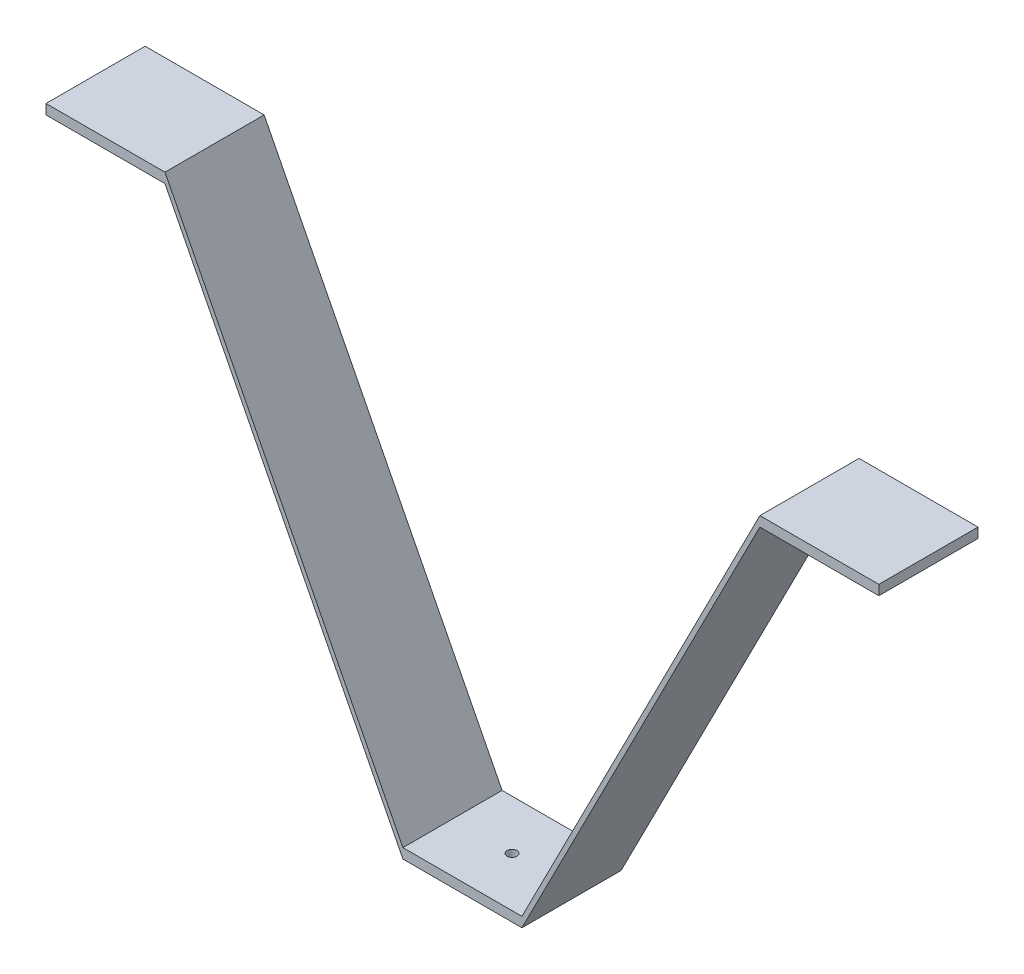
ISO-10303-21;
HEADER;
FILE_DESCRIPTION(('STEP AP214'),'2;1');
FILE_NAME('part.step','',(''),(''),'','','');
FILE_SCHEMA(('AUTOMOTIVE_DESIGN { 1 0 10303 214 1 1 1 1 }'));
ENDSEC;
DATA;
#1=APPLICATION_CONTEXT('core data for automotive mechanical design processes');
#2=APPLICATION_PROTOCOL_DEFINITION('international standard','automotive_design',2000,#1);
#3=PRODUCT_CONTEXT('',#1,'mechanical');
#4=PRODUCT('Part','Part','',(#3));
#5=PRODUCT_RELATED_PRODUCT_CATEGORY('part','',(#4));
#6=PRODUCT_DEFINITION_FORMATION('','',#4);
#7=PRODUCT_DEFINITION_CONTEXT('part definition',#1,'design');
#8=PRODUCT_DEFINITION('design','',#6,#7);
#9=PRODUCT_DEFINITION_SHAPE('','',#8);
#10=(LENGTH_UNIT() NAMED_UNIT(*) SI_UNIT(.MILLI.,.METRE.));
#11=(NAMED_UNIT(*) PLANE_ANGLE_UNIT() SI_UNIT($,.RADIAN.));
#12=(NAMED_UNIT(*) SI_UNIT($,.STERADIAN.) SOLID_ANGLE_UNIT());
#13=UNCERTAINTY_MEASURE_WITH_UNIT(LENGTH_MEASURE(1.E-05),#10,'distance_accuracy_value','');
#14=(GEOMETRIC_REPRESENTATION_CONTEXT(3) GLOBAL_UNCERTAINTY_ASSIGNED_CONTEXT((#13)) GLOBAL_UNIT_ASSIGNED_CONTEXT((#10,
#11,#12)) REPRESENTATION_CONTEXT('',''));
#15=CARTESIAN_POINT('',(0.,0.,0.));
#16=DIRECTION('',(0.,0.,1.));
#17=DIRECTION('',(1.,0.,0.));
#18=AXIS2_PLACEMENT_3D('',#15,#16,#17);
#19=CARTESIAN_POINT('',(-38.1,6.35,-31.75));
#20=DIRECTION('',(0.,0.,1.));
#21=DIRECTION('',(1.,0.,0.));
#22=AXIS2_PLACEMENT_3D('',#19,#20,#21);
#23=PLANE('',#22);
#24=DIRECTION('',(-1.,0.,0.));
#25=VECTOR('',#24,1.);
#26=CARTESIAN_POINT('',(-38.1,0.,-31.75));
#27=LINE('',#26,#25);
#28=CARTESIAN_POINT('',(38.1,0.,-31.75));
#29=VERTEX_POINT('',#28);
#30=CARTESIAN_POINT('',(-38.1,0.,-31.75));
#31=VERTEX_POINT('',#30);
#32=EDGE_CURVE('E69',#29,#31,#27,.T.);
#33=ORIENTED_EDGE('',*,*,#32,.T.);
#34=DIRECTION('',(-0.454777156548669,0.890605264907809,0.));
#35=VECTOR('',#34,1.);
#36=CARTESIAN_POINT('',(-38.1,0.,-31.75));
#37=LINE('',#36,#35);
#38=CARTESIAN_POINT('',(-190.5,298.45,-31.75));
#39=VERTEX_POINT('',#38);
#40=EDGE_CURVE('E111',#31,#39,#37,.T.);
#41=ORIENTED_EDGE('',*,*,#40,.T.);
#42=DIRECTION('',(1.,0.,0.));
#43=VECTOR('',#42,1.);
#44=CARTESIAN_POINT('',(-266.7,298.449999999999,-31.75));
#45=LINE('',#44,#43);
#46=CARTESIAN_POINT('',(-266.7,298.449999999999,-31.75));
#47=VERTEX_POINT('',#46);
#48=EDGE_CURVE('E189',#47,#39,#45,.T.);
#49=ORIENTED_EDGE('',*,*,#48,.F.);
#50=DIRECTION('',(0.,1.,0.));
#51=VECTOR('',#50,1.);
#52=CARTESIAN_POINT('',(-266.7,304.8,-31.75));
#53=LINE('',#52,#51);
#54=CARTESIAN_POINT('',(-266.7,304.8,-31.75));
#55=VERTEX_POINT('',#54);
#56=EDGE_CURVE('E198',#47,#55,#53,.T.);
#57=ORIENTED_EDGE('',*,*,#56,.T.);
#58=DIRECTION('',(1.,0.,0.));
#59=VECTOR('',#58,1.);
#60=CARTESIAN_POINT('',(-266.7,304.8,-31.75));
#61=LINE('',#60,#59);
#62=CARTESIAN_POINT('',(-190.5,304.8,-31.75));
#63=VERTEX_POINT('',#62);
#64=EDGE_CURVE('E107',#55,#63,#61,.T.);
#65=ORIENTED_EDGE('',*,*,#64,.T.);
#66=DIRECTION('',(0.454777156548668,-0.890605264907809,0.));
#67=VECTOR('',#66,1.);
#68=CARTESIAN_POINT('',(-38.1,6.35,-31.75));
#69=LINE('',#68,#67);
#70=CARTESIAN_POINT('',(-38.1,6.35,-31.75));
#71=VERTEX_POINT('',#70);
#72=EDGE_CURVE('E103',#63,#71,#69,.T.);
#73=ORIENTED_EDGE('',*,*,#72,.T.);
#74=DIRECTION('',(-1.,0.,0.));
#75=VECTOR('',#74,1.);
#76=CARTESIAN_POINT('',(-38.1,6.35,-31.75));
#77=LINE('',#76,#75);
#78=CARTESIAN_POINT('',(38.1,6.35,-31.75));
#79=VERTEX_POINT('',#78);
#80=EDGE_CURVE('E94',#79,#71,#77,.T.);
#81=ORIENTED_EDGE('',*,*,#80,.F.);
#82=DIRECTION('',(-0.454777156548668,-0.890605264907809,0.));
#83=VECTOR('',#82,1.);
#84=CARTESIAN_POINT('',(38.1,6.35,-31.75));
#85=LINE('',#84,#83);
#86=CARTESIAN_POINT('',(190.5,304.8,-31.75));
#87=VERTEX_POINT('',#86);
#88=EDGE_CURVE('E142',#87,#79,#85,.T.);
#89=ORIENTED_EDGE('',*,*,#88,.F.);
#90=DIRECTION('',(-1.,0.,0.));
#91=VECTOR('',#90,1.);
#92=CARTESIAN_POINT('',(266.7,304.8,-31.75));
#93=LINE('',#92,#91);
#94=CARTESIAN_POINT('',(266.7,304.8,-31.75));
#95=VERTEX_POINT('',#94);
#96=EDGE_CURVE('E158',#95,#87,#93,.T.);
#97=ORIENTED_EDGE('',*,*,#96,.F.);
#98=DIRECTION('',(0.,1.,0.));
#99=VECTOR('',#98,1.);
#100=CARTESIAN_POINT('',(266.7,304.8,-31.75));
#101=LINE('',#100,#99);
#102=CARTESIAN_POINT('',(266.7,298.449999999999,-31.75));
#103=VERTEX_POINT('',#102);
#104=EDGE_CURVE('E167',#103,#95,#101,.T.);
#105=ORIENTED_EDGE('',*,*,#104,.F.);
#106=DIRECTION('',(-1.,0.,0.));
#107=VECTOR('',#106,1.);
#108=CARTESIAN_POINT('',(266.7,298.449999999999,-31.75));
#109=LINE('',#108,#107);
#110=CARTESIAN_POINT('',(190.5,298.45,-31.75));
#111=VERTEX_POINT('',#110);
#112=EDGE_CURVE('E155',#103,#111,#109,.T.);
#113=ORIENTED_EDGE('',*,*,#112,.T.);
#114=DIRECTION('',(0.454777156548669,0.890605264907809,0.));
#115=VECTOR('',#114,1.);
#116=CARTESIAN_POINT('',(38.1,0.,-31.75));
#117=LINE('',#116,#115);
#118=EDGE_CURVE('E147',#29,#111,#117,.T.);
#119=ORIENTED_EDGE('',*,*,#118,.F.);
#120=EDGE_LOOP('',(#33,#41,#49,#57,#65,#73,#81,#89,#97,#105,#113,#119));
#121=FACE_BOUND('',#120,.T.);
#122=ADVANCED_FACE('F41',(#121),#23,.F.);
#123=CARTESIAN_POINT('',(-38.1,6.35,31.75));
#124=DIRECTION('',(0.,0.,-1.));
#125=DIRECTION('',(-1.,0.,0.));
#126=AXIS2_PLACEMENT_3D('',#123,#124,#125);
#127=PLANE('',#126);
#128=DIRECTION('',(1.,0.,0.));
#129=VECTOR('',#128,1.);
#130=CARTESIAN_POINT('',(-38.1,0.,31.75));
#131=LINE('',#130,#129);
#132=CARTESIAN_POINT('',(-38.1,0.,31.75));
#133=VERTEX_POINT('',#132);
#134=CARTESIAN_POINT('',(38.1,0.,31.75));
#135=VERTEX_POINT('',#134);
#136=EDGE_CURVE('E44',#133,#135,#131,.T.);
#137=ORIENTED_EDGE('',*,*,#136,.T.);
#138=DIRECTION('',(0.454777156548669,0.890605264907809,0.));
#139=VECTOR('',#138,1.);
#140=CARTESIAN_POINT('',(38.1,0.,31.75));
#141=LINE('',#140,#139);
#142=CARTESIAN_POINT('',(190.5,298.45,31.75));
#143=VERTEX_POINT('',#142);
#144=EDGE_CURVE('E148',#135,#143,#141,.T.);
#145=ORIENTED_EDGE('',*,*,#144,.T.);
#146=DIRECTION('',(-1.,0.,0.));
#147=VECTOR('',#146,1.);
#148=CARTESIAN_POINT('',(266.7,298.449999999999,31.75));
#149=LINE('',#148,#147);
#150=CARTESIAN_POINT('',(266.7,298.449999999999,31.75));
#151=VERTEX_POINT('',#150);
#152=EDGE_CURVE('E150',#151,#143,#149,.T.);
#153=ORIENTED_EDGE('',*,*,#152,.F.);
#154=DIRECTION('',(0.,-1.,0.));
#155=VECTOR('',#154,1.);
#156=CARTESIAN_POINT('',(266.7,304.8,31.75));
#157=LINE('',#156,#155);
#158=CARTESIAN_POINT('',(266.7,304.8,31.75));
#159=VERTEX_POINT('',#158);
#160=EDGE_CURVE('E173',#159,#151,#157,.T.);
#161=ORIENTED_EDGE('',*,*,#160,.F.);
#162=DIRECTION('',(-1.,0.,0.));
#163=VECTOR('',#162,1.);
#164=CARTESIAN_POINT('',(266.7,304.8,31.75));
#165=LINE('',#164,#163);
#166=CARTESIAN_POINT('',(190.5,304.8,31.75));
#167=VERTEX_POINT('',#166);
#168=EDGE_CURVE('E161',#159,#167,#165,.T.);
#169=ORIENTED_EDGE('',*,*,#168,.T.);
#170=DIRECTION('',(-0.454777156548668,-0.890605264907809,0.));
#171=VECTOR('',#170,1.);
#172=CARTESIAN_POINT('',(38.1,6.35,31.75));
#173=LINE('',#172,#171);
#174=CARTESIAN_POINT('',(38.1,6.35,31.75));
#175=VERTEX_POINT('',#174);
#176=EDGE_CURVE('E144',#167,#175,#173,.T.);
#177=ORIENTED_EDGE('',*,*,#176,.T.);
#178=DIRECTION('',(1.,0.,0.));
#179=VECTOR('',#178,1.);
#180=CARTESIAN_POINT('',(-38.1,6.35,31.75));
#181=LINE('',#180,#179);
#182=CARTESIAN_POINT('',(-38.1,6.35,31.75));
#183=VERTEX_POINT('',#182);
#184=EDGE_CURVE('E11',#183,#175,#181,.T.);
#185=ORIENTED_EDGE('',*,*,#184,.F.);
#186=DIRECTION('',(0.454777156548668,-0.890605264907809,0.));
#187=VECTOR('',#186,1.);
#188=CARTESIAN_POINT('',(-38.1,6.35,31.75));
#189=LINE('',#188,#187);
#190=CARTESIAN_POINT('',(-190.5,304.8,31.75));
#191=VERTEX_POINT('',#190);
#192=EDGE_CURVE('E117',#191,#183,#189,.T.);
#193=ORIENTED_EDGE('',*,*,#192,.F.);
#194=DIRECTION('',(1.,0.,0.));
#195=VECTOR('',#194,1.);
#196=CARTESIAN_POINT('',(-266.7,304.8,31.75));
#197=LINE('',#196,#195);
#198=CARTESIAN_POINT('',(-266.7,304.8,31.75));
#199=VERTEX_POINT('',#198);
#200=EDGE_CURVE('E183',#199,#191,#197,.T.);
#201=ORIENTED_EDGE('',*,*,#200,.F.);
#202=DIRECTION('',(0.,-1.,0.));
#203=VECTOR('',#202,1.);
#204=CARTESIAN_POINT('',(-266.7,304.8,31.75));
#205=LINE('',#204,#203);
#206=CARTESIAN_POINT('',(-266.7,298.449999999999,31.75));
#207=VERTEX_POINT('',#206);
#208=EDGE_CURVE('E203',#199,#207,#205,.T.);
#209=ORIENTED_EDGE('',*,*,#208,.T.);
#210=DIRECTION('',(1.,0.,0.));
#211=VECTOR('',#210,1.);
#212=CARTESIAN_POINT('',(-266.7,298.449999999999,31.75));
#213=LINE('',#212,#211);
#214=CARTESIAN_POINT('',(-190.5,298.45,31.75));
#215=VERTEX_POINT('',#214);
#216=EDGE_CURVE('E192',#207,#215,#213,.T.);
#217=ORIENTED_EDGE('',*,*,#216,.T.);
#218=DIRECTION('',(-0.454777156548669,0.890605264907809,0.));
#219=VECTOR('',#218,1.);
#220=CARTESIAN_POINT('',(-38.1,0.,31.75));
#221=LINE('',#220,#219);
#222=EDGE_CURVE('E112',#133,#215,#221,.T.);
#223=ORIENTED_EDGE('',*,*,#222,.F.);
#224=EDGE_LOOP('',(#137,#145,#153,#161,#169,#177,#185,#193,#201,#209,#217,#223));
#225=FACE_BOUND('',#224,.T.);
#226=ADVANCED_FACE('F209',(#225),#127,.F.);
#227=CARTESIAN_POINT('',(0.,6.35,0.));
#228=DIRECTION('',(0.,-1.,0.));
#229=DIRECTION('',(0.,0.,-1.));
#230=AXIS2_PLACEMENT_3D('',#227,#228,#229);
#231=PLANE('',#230);
#232=CARTESIAN_POINT('',(0.,6.35,0.));
#233=DIRECTION('',(0.,1.,0.));
#234=DIRECTION('',(0.,0.,1.));
#235=AXIS2_PLACEMENT_3D('',#232,#233,#234);
#236=CIRCLE('',#235,3.175);
#237=CARTESIAN_POINT('',(0.,6.35,3.175));
#238=VERTEX_POINT('',#237);
#239=EDGE_CURVE('E135',#238,#238,#236,.T.);
#240=ORIENTED_EDGE('',*,*,#239,.F.);
#241=EDGE_LOOP('',(#240));
#242=FACE_BOUND('',#241,.T.);
#243=DIRECTION('',(0.,0.,-1.));
#244=VECTOR('',#243,1.);
#245=CARTESIAN_POINT('',(38.1,6.35,31.75));
#246=LINE('',#245,#244);
#247=EDGE_CURVE('E98',#175,#79,#246,.T.);
#248=ORIENTED_EDGE('',*,*,#247,.T.);
#249=ORIENTED_EDGE('',*,*,#80,.T.);
#250=DIRECTION('',(0.,0.,1.));
#251=VECTOR('',#250,1.);
#252=CARTESIAN_POINT('',(-38.1,6.35,31.75));
#253=LINE('',#252,#251);
#254=EDGE_CURVE('E50',#71,#183,#253,.T.);
#255=ORIENTED_EDGE('',*,*,#254,.T.);
#256=ORIENTED_EDGE('',*,*,#184,.T.);
#257=EDGE_LOOP('',(#248,#249,#255,#256));
#258=FACE_BOUND('',#257,.T.);
#259=ADVANCED_FACE('F96',(#242,#258),#231,.F.);
#260=CARTESIAN_POINT('',(0.,0.,0.));
#261=DIRECTION('',(0.,-1.,0.));
#262=DIRECTION('',(0.,0.,-1.));
#263=AXIS2_PLACEMENT_3D('',#260,#261,#262);
#264=PLANE('',#263);
#265=CARTESIAN_POINT('',(0.,0.,0.));
#266=DIRECTION('',(0.,1.,0.));
#267=DIRECTION('',(0.,0.,1.));
#268=AXIS2_PLACEMENT_3D('',#265,#266,#267);
#269=CIRCLE('',#268,3.175);
#270=CARTESIAN_POINT('',(0.,0.,3.175));
#271=VERTEX_POINT('',#270);
#272=EDGE_CURVE('E123',#271,#271,#269,.T.);
#273=ORIENTED_EDGE('',*,*,#272,.T.);
#274=EDGE_LOOP('',(#273));
#275=FACE_BOUND('',#274,.T.);
#276=DIRECTION('',(0.,0.,-1.));
#277=VECTOR('',#276,1.);
#278=CARTESIAN_POINT('',(38.1,0.,31.75));
#279=LINE('',#278,#277);
#280=EDGE_CURVE('E121',#135,#29,#279,.T.);
#281=ORIENTED_EDGE('',*,*,#280,.F.);
#282=ORIENTED_EDGE('',*,*,#136,.F.);
#283=DIRECTION('',(0.,0.,1.));
#284=VECTOR('',#283,1.);
#285=CARTESIAN_POINT('',(-38.1,0.,31.75));
#286=LINE('',#285,#284);
#287=EDGE_CURVE('E124',#31,#133,#286,.T.);
#288=ORIENTED_EDGE('',*,*,#287,.F.);
#289=ORIENTED_EDGE('',*,*,#32,.F.);
#290=EDGE_LOOP('',(#281,#282,#288,#289));
#291=FACE_BOUND('',#290,.T.);
#292=ADVANCED_FACE('F261',(#275,#291),#264,.T.);
#293=CARTESIAN_POINT('',(0.,0.,0.));
#294=DIRECTION('',(0.,1.,0.));
#295=DIRECTION('',(0.,0.,1.));
#296=AXIS2_PLACEMENT_3D('',#293,#294,#295);
#297=CYLINDRICAL_SURFACE('',#296,3.175);
#298=ORIENTED_EDGE('',*,*,#272,.F.);
#299=EDGE_LOOP('',(#298));
#300=FACE_BOUND('',#299,.T.);
#301=ORIENTED_EDGE('',*,*,#239,.T.);
#302=EDGE_LOOP('',(#301));
#303=FACE_BOUND('',#302,.T.);
#304=ADVANCED_FACE('F285',(#300,#303),#297,.F.);
#305=CARTESIAN_POINT('',(38.1,6.35,-31.75));
#306=DIRECTION('',(-0.890605264907809,0.454777156548668,0.));
#307=DIRECTION('',(-0.454777156548669,-0.890605264907809,0.));
#308=AXIS2_PLACEMENT_3D('',#305,#306,#307);
#309=PLANE('',#308);
#310=ORIENTED_EDGE('',*,*,#176,.F.);
#311=DIRECTION('',(0.,0.,1.));
#312=VECTOR('',#311,1.);
#313=CARTESIAN_POINT('',(190.5,304.8,-31.75));
#314=LINE('',#313,#312);
#315=EDGE_CURVE('E80',#87,#167,#314,.T.);
#316=ORIENTED_EDGE('',*,*,#315,.F.);
#317=ORIENTED_EDGE('',*,*,#88,.T.);
#318=ORIENTED_EDGE('',*,*,#247,.F.);
#319=EDGE_LOOP('',(#310,#316,#317,#318));
#320=FACE_BOUND('',#319,.T.);
#321=ADVANCED_FACE('F243',(#320),#309,.T.);
#322=CARTESIAN_POINT('',(38.1,0.,-31.75));
#323=DIRECTION('',(0.890605264907808,-0.454777156548668,0.));
#324=DIRECTION('',(0.454777156548669,0.890605264907809,0.));
#325=AXIS2_PLACEMENT_3D('',#322,#323,#324);
#326=PLANE('',#325);
#327=ORIENTED_EDGE('',*,*,#144,.F.);
#328=ORIENTED_EDGE('',*,*,#280,.T.);
#329=ORIENTED_EDGE('',*,*,#118,.T.);
#330=DIRECTION('',(0.,0.,1.));
#331=VECTOR('',#330,1.);
#332=CARTESIAN_POINT('',(190.5,298.45,-31.75));
#333=LINE('',#332,#331);
#334=EDGE_CURVE('E140',#111,#143,#333,.T.);
#335=ORIENTED_EDGE('',*,*,#334,.T.);
#336=EDGE_LOOP('',(#327,#328,#329,#335));
#337=FACE_BOUND('',#336,.T.);
#338=ADVANCED_FACE('F260',(#337),#326,.T.);
#339=CARTESIAN_POINT('',(266.7,298.449999999999,31.75));
#340=DIRECTION('',(0.,1.,0.));
#341=DIRECTION('',(-1.,0.,0.));
#342=AXIS2_PLACEMENT_3D('',#339,#340,#341);
#343=PLANE('',#342);
#344=ORIENTED_EDGE('',*,*,#334,.F.);
#345=ORIENTED_EDGE('',*,*,#112,.F.);
#346=DIRECTION('',(0.,0.,-1.));
#347=VECTOR('',#346,1.);
#348=CARTESIAN_POINT('',(266.7,298.449999999999,31.75));
#349=LINE('',#348,#347);
#350=EDGE_CURVE('E170',#151,#103,#349,.T.);
#351=ORIENTED_EDGE('',*,*,#350,.F.);
#352=ORIENTED_EDGE('',*,*,#152,.T.);
#353=EDGE_LOOP('',(#344,#345,#351,#352));
#354=FACE_BOUND('',#353,.T.);
#355=ADVANCED_FACE('F258',(#354),#343,.F.);
#356=CARTESIAN_POINT('',(266.7,304.8,31.75));
#357=DIRECTION('',(0.,-1.,0.));
#358=DIRECTION('',(1.,0.,0.));
#359=AXIS2_PLACEMENT_3D('',#356,#357,#358);
#360=PLANE('',#359);
#361=ORIENTED_EDGE('',*,*,#315,.T.);
#362=ORIENTED_EDGE('',*,*,#168,.F.);
#363=DIRECTION('',(0.,0.,1.));
#364=VECTOR('',#363,1.);
#365=CARTESIAN_POINT('',(266.7,304.8,31.75));
#366=LINE('',#365,#364);
#367=EDGE_CURVE('E164',#95,#159,#366,.T.);
#368=ORIENTED_EDGE('',*,*,#367,.F.);
#369=ORIENTED_EDGE('',*,*,#96,.T.);
#370=EDGE_LOOP('',(#361,#362,#368,#369));
#371=FACE_BOUND('',#370,.T.);
#372=ADVANCED_FACE('F246',(#371),#360,.F.);
#373=CARTESIAN_POINT('',(266.699999999999,-1.16573417585638E-12,0.));
#374=DIRECTION('',(1.,0.,0.));
#375=DIRECTION('',(0.,1.,0.));
#376=AXIS2_PLACEMENT_3D('',#373,#374,#375);
#377=PLANE('',#376);
#378=ORIENTED_EDGE('',*,*,#160,.T.);
#379=ORIENTED_EDGE('',*,*,#350,.T.);
#380=ORIENTED_EDGE('',*,*,#104,.T.);
#381=ORIENTED_EDGE('',*,*,#367,.T.);
#382=EDGE_LOOP('',(#378,#379,#380,#381));
#383=FACE_BOUND('',#382,.T.);
#384=ADVANCED_FACE('F252',(#383),#377,.T.);
#385=CARTESIAN_POINT('',(-38.1,0.,-31.75));
#386=DIRECTION('',(0.890605264907808,0.454777156548668,0.));
#387=DIRECTION('',(-0.454777156548669,0.890605264907809,0.));
#388=AXIS2_PLACEMENT_3D('',#385,#386,#387);
#389=PLANE('',#388);
#390=ORIENTED_EDGE('',*,*,#222,.T.);
#391=DIRECTION('',(0.,0.,1.));
#392=VECTOR('',#391,1.);
#393=CARTESIAN_POINT('',(-190.5,298.45,-31.75));
#394=LINE('',#393,#392);
#395=EDGE_CURVE('E176',#39,#215,#394,.T.);
#396=ORIENTED_EDGE('',*,*,#395,.F.);
#397=ORIENTED_EDGE('',*,*,#40,.F.);
#398=ORIENTED_EDGE('',*,*,#287,.T.);
#399=EDGE_LOOP('',(#390,#396,#397,#398));
#400=FACE_BOUND('',#399,.T.);
#401=ADVANCED_FACE('F263',(#400),#389,.F.);
#402=CARTESIAN_POINT('',(-38.1,6.35,-31.75));
#403=DIRECTION('',(-0.890605264907809,-0.454777156548668,0.));
#404=DIRECTION('',(0.454777156548669,-0.890605264907809,0.));
#405=AXIS2_PLACEMENT_3D('',#402,#403,#404);
#406=PLANE('',#405);
#407=ORIENTED_EDGE('',*,*,#192,.T.);
#408=ORIENTED_EDGE('',*,*,#254,.F.);
#409=ORIENTED_EDGE('',*,*,#72,.F.);
#410=DIRECTION('',(0.,0.,1.));
#411=VECTOR('',#410,1.);
#412=CARTESIAN_POINT('',(-190.5,304.8,-31.75));
#413=LINE('',#412,#411);
#414=EDGE_CURVE('E177',#63,#191,#413,.T.);
#415=ORIENTED_EDGE('',*,*,#414,.T.);
#416=EDGE_LOOP('',(#407,#408,#409,#415));
#417=FACE_BOUND('',#416,.T.);
#418=ADVANCED_FACE('F115',(#417),#406,.F.);
#419=CARTESIAN_POINT('',(-266.7,304.8,31.75));
#420=DIRECTION('',(0.,1.,0.));
#421=DIRECTION('',(-1.,0.,0.));
#422=AXIS2_PLACEMENT_3D('',#419,#420,#421);
#423=PLANE('',#422);
#424=ORIENTED_EDGE('',*,*,#414,.F.);
#425=ORIENTED_EDGE('',*,*,#64,.F.);
#426=DIRECTION('',(0.,0.,1.));
#427=VECTOR('',#426,1.);
#428=CARTESIAN_POINT('',(-266.7,304.8,31.75));
#429=LINE('',#428,#427);
#430=EDGE_CURVE('E200',#55,#199,#429,.T.);
#431=ORIENTED_EDGE('',*,*,#430,.T.);
#432=ORIENTED_EDGE('',*,*,#200,.T.);
#433=EDGE_LOOP('',(#424,#425,#431,#432));
#434=FACE_BOUND('',#433,.T.);
#435=ADVANCED_FACE('F270',(#434),#423,.T.);
#436=CARTESIAN_POINT('',(-266.7,298.449999999999,31.75));
#437=DIRECTION('',(0.,-1.,0.));
#438=DIRECTION('',(1.,0.,0.));
#439=AXIS2_PLACEMENT_3D('',#436,#437,#438);
#440=PLANE('',#439);
#441=ORIENTED_EDGE('',*,*,#395,.T.);
#442=ORIENTED_EDGE('',*,*,#216,.F.);
#443=DIRECTION('',(0.,0.,-1.));
#444=VECTOR('',#443,1.);
#445=CARTESIAN_POINT('',(-266.7,298.449999999999,31.75));
#446=LINE('',#445,#444);
#447=EDGE_CURVE('E195',#207,#47,#446,.T.);
#448=ORIENTED_EDGE('',*,*,#447,.T.);
#449=ORIENTED_EDGE('',*,*,#48,.T.);
#450=EDGE_LOOP('',(#441,#442,#448,#449));
#451=FACE_BOUND('',#450,.T.);
#452=ADVANCED_FACE('F221',(#451),#440,.T.);
#453=CARTESIAN_POINT('',(-266.699999999999,-1.16573417585638E-12,0.));
#454=DIRECTION('',(-1.,0.,0.));
#455=DIRECTION('',(0.,1.,0.));
#456=AXIS2_PLACEMENT_3D('',#453,#454,#455);
#457=PLANE('',#456);
#458=ORIENTED_EDGE('',*,*,#208,.F.);
#459=ORIENTED_EDGE('',*,*,#430,.F.);
#460=ORIENTED_EDGE('',*,*,#56,.F.);
#461=ORIENTED_EDGE('',*,*,#447,.F.);
#462=EDGE_LOOP('',(#458,#459,#460,#461));
#463=FACE_BOUND('',#462,.T.);
#464=ADVANCED_FACE('F219',(#463),#457,.T.);
#465=CLOSED_SHELL('',(#122,#226,#259,#292,#304,#321,#338,#355,#372,#384,#401,#418,#435,#452,#464));
#466=MANIFOLD_SOLID_BREP('B2',#465);
#467=ADVANCED_BREP_SHAPE_REPRESENTATION('',(#18,#466),#14);
#468=SHAPE_DEFINITION_REPRESENTATION(#9,#467);
ENDSEC;
END-ISO-10303-21;
